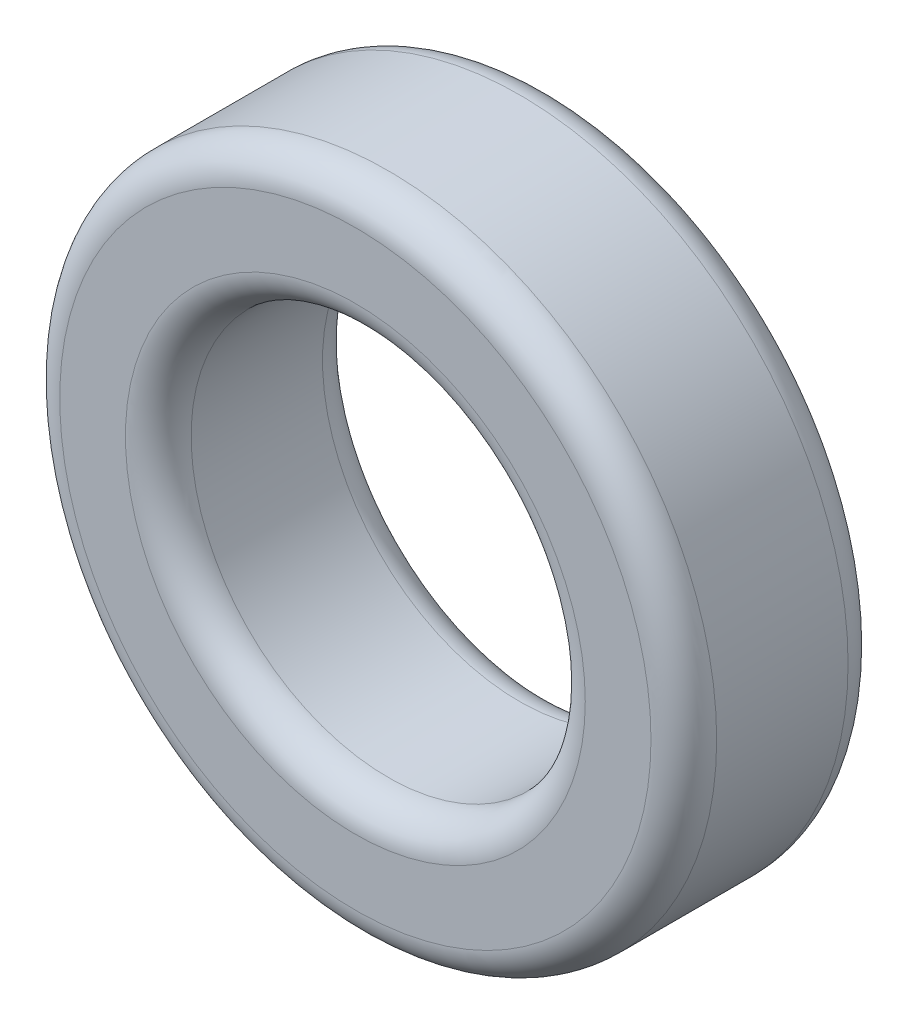
ISO-10303-21;
HEADER;
FILE_DESCRIPTION(('STEP AP214'),'2;1');
FILE_NAME('part.step','',(''),(''),'','','');
FILE_SCHEMA(('AUTOMOTIVE_DESIGN { 1 0 10303 214 1 1 1 1 }'));
ENDSEC;
DATA;
#1=APPLICATION_CONTEXT('core data for automotive mechanical design processes');
#2=APPLICATION_PROTOCOL_DEFINITION('international standard','automotive_design',2000,#1);
#3=PRODUCT_CONTEXT('',#1,'mechanical');
#4=PRODUCT('Part','Part','',(#3));
#5=PRODUCT_RELATED_PRODUCT_CATEGORY('part','',(#4));
#6=PRODUCT_DEFINITION_FORMATION('','',#4);
#7=PRODUCT_DEFINITION_CONTEXT('part definition',#1,'design');
#8=PRODUCT_DEFINITION('design','',#6,#7);
#9=PRODUCT_DEFINITION_SHAPE('','',#8);
#10=(LENGTH_UNIT() NAMED_UNIT(*) SI_UNIT(.MILLI.,.METRE.));
#11=(NAMED_UNIT(*) PLANE_ANGLE_UNIT() SI_UNIT($,.RADIAN.));
#12=(NAMED_UNIT(*) SI_UNIT($,.STERADIAN.) SOLID_ANGLE_UNIT());
#13=UNCERTAINTY_MEASURE_WITH_UNIT(LENGTH_MEASURE(1.E-05),#10,'distance_accuracy_value','');
#14=(GEOMETRIC_REPRESENTATION_CONTEXT(3) GLOBAL_UNCERTAINTY_ASSIGNED_CONTEXT((#13)) GLOBAL_UNIT_ASSIGNED_CONTEXT((#10,
#11,#12)) REPRESENTATION_CONTEXT('',''));
#15=CARTESIAN_POINT('',(0.,0.,0.));
#16=DIRECTION('',(0.,0.,1.));
#17=DIRECTION('',(1.,0.,0.));
#18=AXIS2_PLACEMENT_3D('',#15,#16,#17);
#19=CARTESIAN_POINT('',(0.,0.,3.));
#20=DIRECTION('',(0.,0.,1.));
#21=DIRECTION('',(1.,0.,0.));
#22=AXIS2_PLACEMENT_3D('',#19,#20,#21);
#23=PLANE('',#22);
#24=CARTESIAN_POINT('',(0.,0.,3.));
#25=DIRECTION('',(0.,0.,1.));
#26=DIRECTION('',(1.,0.,0.));
#27=AXIS2_PLACEMENT_3D('',#24,#25,#26);
#28=CIRCLE('',#27,3.5);
#29=CARTESIAN_POINT('',(3.5,0.,3.));
#30=VERTEX_POINT('',#29);
#31=EDGE_CURVE('E44',#30,#30,#28,.F.);
#32=ORIENTED_EDGE('',*,*,#31,.T.);
#33=EDGE_LOOP('',(#32));
#34=FACE_BOUND('',#33,.T.);
#35=CARTESIAN_POINT('',(0.,0.,3.));
#36=DIRECTION('',(0.,0.,1.));
#37=DIRECTION('',(1.,0.,0.));
#38=AXIS2_PLACEMENT_3D('',#35,#36,#37);
#39=CIRCLE('',#38,4.5);
#40=CARTESIAN_POINT('',(4.5,0.,3.));
#41=VERTEX_POINT('',#40);
#42=EDGE_CURVE('E48',#41,#41,#39,.T.);
#43=ORIENTED_EDGE('',*,*,#42,.T.);
#44=EDGE_LOOP('',(#43));
#45=FACE_BOUND('',#44,.T.);
#46=ADVANCED_FACE('F33',(#34,#45),#23,.T.);
#47=CARTESIAN_POINT('',(0.,0.,0.));
#48=DIRECTION('',(0.,0.,1.));
#49=DIRECTION('',(1.,0.,0.));
#50=AXIS2_PLACEMENT_3D('',#47,#48,#49);
#51=PLANE('',#50);
#52=CARTESIAN_POINT('',(0.,0.,0.));
#53=DIRECTION('',(0.,0.,1.));
#54=DIRECTION('',(1.,0.,0.));
#55=AXIS2_PLACEMENT_3D('',#52,#53,#54);
#56=CIRCLE('',#55,3.5);
#57=CARTESIAN_POINT('',(3.5,0.,0.));
#58=VERTEX_POINT('',#57);
#59=EDGE_CURVE('E59',#58,#58,#56,.T.);
#60=ORIENTED_EDGE('',*,*,#59,.T.);
#61=EDGE_LOOP('',(#60));
#62=FACE_BOUND('',#61,.T.);
#63=CARTESIAN_POINT('',(0.,0.,0.));
#64=DIRECTION('',(0.,0.,1.));
#65=DIRECTION('',(1.,0.,0.));
#66=AXIS2_PLACEMENT_3D('',#63,#64,#65);
#67=CIRCLE('',#66,4.5);
#68=CARTESIAN_POINT('',(4.5,0.,0.));
#69=VERTEX_POINT('',#68);
#70=EDGE_CURVE('E62',#69,#69,#67,.F.);
#71=ORIENTED_EDGE('',*,*,#70,.T.);
#72=EDGE_LOOP('',(#71));
#73=FACE_BOUND('',#72,.T.);
#74=ADVANCED_FACE('F66',(#62,#73),#51,.F.);
#75=CARTESIAN_POINT('',(0.,0.,3.));
#76=DIRECTION('',(0.,0.,-1.));
#77=DIRECTION('',(-1.,0.,0.));
#78=AXIS2_PLACEMENT_3D('',#75,#76,#77);
#79=CYLINDRICAL_SURFACE('',#78,5.);
#80=CARTESIAN_POINT('',(0.,0.,0.5));
#81=DIRECTION('',(0.,0.,1.));
#82=DIRECTION('',(1.,0.,0.));
#83=AXIS2_PLACEMENT_3D('',#80,#81,#82);
#84=CIRCLE('',#83,5.);
#85=CARTESIAN_POINT('',(5.,0.,0.5));
#86=VERTEX_POINT('',#85);
#87=EDGE_CURVE('E10',#86,#86,#84,.T.);
#88=ORIENTED_EDGE('',*,*,#87,.T.);
#89=EDGE_LOOP('',(#88));
#90=FACE_BOUND('',#89,.T.);
#91=CARTESIAN_POINT('',(0.,0.,2.5));
#92=DIRECTION('',(0.,0.,1.));
#93=DIRECTION('',(1.,0.,0.));
#94=AXIS2_PLACEMENT_3D('',#91,#92,#93);
#95=CIRCLE('',#94,5.);
#96=CARTESIAN_POINT('',(5.,0.,2.5));
#97=VERTEX_POINT('',#96);
#98=EDGE_CURVE('E40',#97,#97,#95,.F.);
#99=ORIENTED_EDGE('',*,*,#98,.T.);
#100=EDGE_LOOP('',(#99));
#101=FACE_BOUND('',#100,.T.);
#102=ADVANCED_FACE('F86',(#90,#101),#79,.T.);
#103=CARTESIAN_POINT('',(0.,0.,3.));
#104=DIRECTION('',(0.,0.,-1.));
#105=DIRECTION('',(-1.,0.,0.));
#106=AXIS2_PLACEMENT_3D('',#103,#104,#105);
#107=CYLINDRICAL_SURFACE('',#106,3.);
#108=CARTESIAN_POINT('',(0.,0.,0.5));
#109=DIRECTION('',(0.,0.,1.));
#110=DIRECTION('',(1.,0.,0.));
#111=AXIS2_PLACEMENT_3D('',#108,#109,#110);
#112=CIRCLE('',#111,3.);
#113=CARTESIAN_POINT('',(3.,0.,0.5));
#114=VERTEX_POINT('',#113);
#115=EDGE_CURVE('E53',#114,#114,#112,.F.);
#116=ORIENTED_EDGE('',*,*,#115,.T.);
#117=EDGE_LOOP('',(#116));
#118=FACE_BOUND('',#117,.T.);
#119=CARTESIAN_POINT('',(0.,0.,2.5));
#120=DIRECTION('',(0.,0.,1.));
#121=DIRECTION('',(1.,0.,0.));
#122=AXIS2_PLACEMENT_3D('',#119,#120,#121);
#123=CIRCLE('',#122,3.);
#124=CARTESIAN_POINT('',(3.,0.,2.5));
#125=VERTEX_POINT('',#124);
#126=EDGE_CURVE('E56',#125,#125,#123,.T.);
#127=ORIENTED_EDGE('',*,*,#126,.T.);
#128=EDGE_LOOP('',(#127));
#129=FACE_BOUND('',#128,.T.);
#130=ADVANCED_FACE('F91',(#118,#129),#107,.F.);
#131=CARTESIAN_POINT('',(0.,0.,0.5));
#132=DIRECTION('',(0.,0.,1.));
#133=DIRECTION('',(1.,0.,0.));
#134=AXIS2_PLACEMENT_3D('',#131,#132,#133);
#135=TOROIDAL_SURFACE('',#134,3.5,0.5);
#136=ORIENTED_EDGE('',*,*,#115,.F.);
#137=EDGE_LOOP('',(#136));
#138=FACE_BOUND('',#137,.T.);
#139=ORIENTED_EDGE('',*,*,#59,.F.);
#140=EDGE_LOOP('',(#139));
#141=FACE_BOUND('',#140,.T.);
#142=ADVANCED_FACE('F77',(#138,#141),#135,.T.);
#143=CARTESIAN_POINT('',(0.,0.,2.5));
#144=DIRECTION('',(0.,0.,1.));
#145=DIRECTION('',(1.,0.,0.));
#146=AXIS2_PLACEMENT_3D('',#143,#144,#145);
#147=TOROIDAL_SURFACE('',#146,3.5,0.5);
#148=ORIENTED_EDGE('',*,*,#31,.F.);
#149=EDGE_LOOP('',(#148));
#150=FACE_BOUND('',#149,.T.);
#151=ORIENTED_EDGE('',*,*,#126,.F.);
#152=EDGE_LOOP('',(#151));
#153=FACE_BOUND('',#152,.T.);
#154=ADVANCED_FACE('F71',(#150,#153),#147,.T.);
#155=CARTESIAN_POINT('',(0.,0.,0.5));
#156=DIRECTION('',(0.,0.,1.));
#157=DIRECTION('',(1.,0.,0.));
#158=AXIS2_PLACEMENT_3D('',#155,#156,#157);
#159=TOROIDAL_SURFACE('',#158,4.5,0.5);
#160=ORIENTED_EDGE('',*,*,#70,.F.);
#161=EDGE_LOOP('',(#160));
#162=FACE_BOUND('',#161,.T.);
#163=ORIENTED_EDGE('',*,*,#87,.F.);
#164=EDGE_LOOP('',(#163));
#165=FACE_BOUND('',#164,.T.);
#166=ADVANCED_FACE('F68',(#162,#165),#159,.T.);
#167=CARTESIAN_POINT('',(0.,0.,2.5));
#168=DIRECTION('',(0.,0.,1.));
#169=DIRECTION('',(1.,0.,0.));
#170=AXIS2_PLACEMENT_3D('',#167,#168,#169);
#171=TOROIDAL_SURFACE('',#170,4.5,0.5);
#172=ORIENTED_EDGE('',*,*,#98,.F.);
#173=EDGE_LOOP('',(#172));
#174=FACE_BOUND('',#173,.T.);
#175=ORIENTED_EDGE('',*,*,#42,.F.);
#176=EDGE_LOOP('',(#175));
#177=FACE_BOUND('',#176,.T.);
#178=ADVANCED_FACE('F35',(#174,#177),#171,.T.);
#179=CLOSED_SHELL('',(#46,#74,#102,#130,#142,#154,#166,#178));
#180=MANIFOLD_SOLID_BREP('B2',#179);
#181=ADVANCED_BREP_SHAPE_REPRESENTATION('',(#18,#180),#14);
#182=SHAPE_DEFINITION_REPRESENTATION(#9,#181);
ENDSEC;
END-ISO-10303-21;
